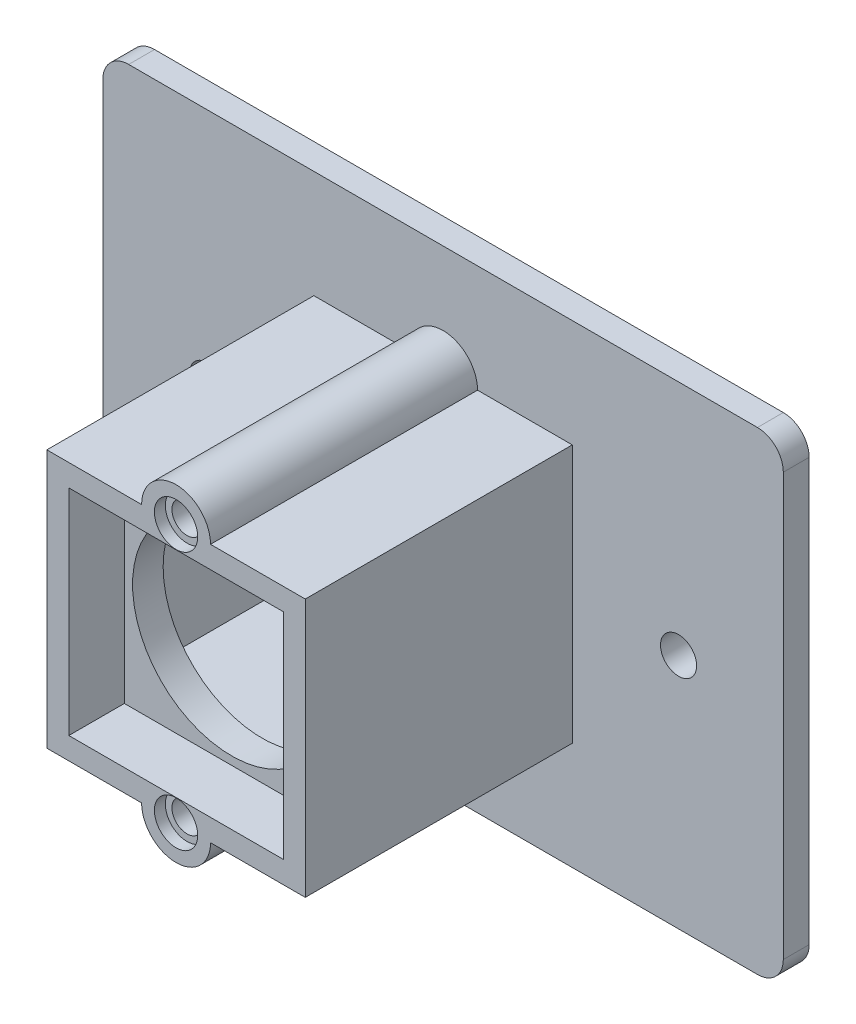
ISO-10303-21;
HEADER;
FILE_DESCRIPTION(('STEP AP214'),'2;1');
FILE_NAME('part.step','',(''),(''),'','','');
FILE_SCHEMA(('AUTOMOTIVE_DESIGN { 1 0 10303 214 1 1 1 1 }'));
ENDSEC;
DATA;
#1=APPLICATION_CONTEXT('core data for automotive mechanical design processes');
#2=APPLICATION_PROTOCOL_DEFINITION('international standard','automotive_design',2000,#1);
#3=PRODUCT_CONTEXT('',#1,'mechanical');
#4=PRODUCT('Part','Part','',(#3));
#5=PRODUCT_RELATED_PRODUCT_CATEGORY('part','',(#4));
#6=PRODUCT_DEFINITION_FORMATION('','',#4);
#7=PRODUCT_DEFINITION_CONTEXT('part definition',#1,'design');
#8=PRODUCT_DEFINITION('design','',#6,#7);
#9=PRODUCT_DEFINITION_SHAPE('','',#8);
#10=(LENGTH_UNIT() NAMED_UNIT(*) SI_UNIT(.MILLI.,.METRE.));
#11=(NAMED_UNIT(*) PLANE_ANGLE_UNIT() SI_UNIT($,.RADIAN.));
#12=(NAMED_UNIT(*) SI_UNIT($,.STERADIAN.) SOLID_ANGLE_UNIT());
#13=UNCERTAINTY_MEASURE_WITH_UNIT(LENGTH_MEASURE(1.E-05),#10,'distance_accuracy_value','');
#14=(GEOMETRIC_REPRESENTATION_CONTEXT(3) GLOBAL_UNCERTAINTY_ASSIGNED_CONTEXT((#13)) GLOBAL_UNIT_ASSIGNED_CONTEXT((#10,
#11,#12)) REPRESENTATION_CONTEXT('',''));
#15=CARTESIAN_POINT('',(0.,0.,0.));
#16=DIRECTION('',(0.,0.,1.));
#17=DIRECTION('',(1.,0.,0.));
#18=AXIS2_PLACEMENT_3D('',#15,#16,#17);
#19=CARTESIAN_POINT('',(38.,12.75,-22.));
#20=DIRECTION('',(0.,0.,-1.));
#21=DIRECTION('',(0.,1.,0.));
#22=AXIS2_PLACEMENT_3D('',#19,#20,#21);
#23=PLANE('',#22);
#24=DIRECTION('',(-1.,0.,0.));
#25=VECTOR('',#24,1.);
#26=CARTESIAN_POINT('',(0.,27.5,-22.));
#27=LINE('',#26,#25);
#28=CARTESIAN_POINT('',(36.5,27.5,-22.));
#29=VERTEX_POINT('',#28);
#30=CARTESIAN_POINT('',(-36.5,27.5,-22.));
#31=VERTEX_POINT('',#30);
#32=EDGE_CURVE('E494',#29,#31,#27,.T.);
#33=ORIENTED_EDGE('',*,*,#32,.T.);
#34=CARTESIAN_POINT('',(-36.5,24.5,-22.));
#35=DIRECTION('',(0.,0.,-1.));
#36=DIRECTION('',(0.,1.,0.));
#37=AXIS2_PLACEMENT_3D('',#34,#35,#36);
#38=CIRCLE('',#37,3.);
#39=CARTESIAN_POINT('',(-39.5,24.5,-22.));
#40=VERTEX_POINT('',#39);
#41=EDGE_CURVE('E299',#31,#40,#38,.F.);
#42=ORIENTED_EDGE('',*,*,#41,.T.);
#43=DIRECTION('',(0.,1.,0.));
#44=VECTOR('',#43,1.);
#45=CARTESIAN_POINT('',(-39.5,0.,-22.));
#46=LINE('',#45,#44);
#47=CARTESIAN_POINT('',(-39.5,-24.5,-22.));
#48=VERTEX_POINT('',#47);
#49=EDGE_CURVE('E489',#48,#40,#46,.T.);
#50=ORIENTED_EDGE('',*,*,#49,.F.);
#51=CARTESIAN_POINT('',(-36.5,-24.5,-22.));
#52=DIRECTION('',(0.,0.,-1.));
#53=DIRECTION('',(0.,1.,0.));
#54=AXIS2_PLACEMENT_3D('',#51,#52,#53);
#55=CIRCLE('',#54,3.);
#56=CARTESIAN_POINT('',(-36.5,-27.5,-22.));
#57=VERTEX_POINT('',#56);
#58=EDGE_CURVE('E296',#48,#57,#55,.F.);
#59=ORIENTED_EDGE('',*,*,#58,.T.);
#60=DIRECTION('',(-1.,0.,0.));
#61=VECTOR('',#60,1.);
#62=CARTESIAN_POINT('',(0.,-27.5,-22.));
#63=LINE('',#62,#61);
#64=CARTESIAN_POINT('',(36.5,-27.5,-22.));
#65=VERTEX_POINT('',#64);
#66=EDGE_CURVE('E485',#65,#57,#63,.T.);
#67=ORIENTED_EDGE('',*,*,#66,.F.);
#68=CARTESIAN_POINT('',(36.5,-24.5,-22.));
#69=DIRECTION('',(0.,0.,-1.));
#70=DIRECTION('',(0.,1.,0.));
#71=AXIS2_PLACEMENT_3D('',#68,#69,#70);
#72=CIRCLE('',#71,3.);
#73=CARTESIAN_POINT('',(39.5,-24.5,-22.));
#74=VERTEX_POINT('',#73);
#75=EDGE_CURVE('E293',#65,#74,#72,.F.);
#76=ORIENTED_EDGE('',*,*,#75,.T.);
#77=DIRECTION('',(0.,1.,0.));
#78=VECTOR('',#77,1.);
#79=CARTESIAN_POINT('',(39.5,0.,-22.));
#80=LINE('',#79,#78);
#81=CARTESIAN_POINT('',(39.5,24.5,-22.));
#82=VERTEX_POINT('',#81);
#83=EDGE_CURVE('E498',#74,#82,#80,.T.);
#84=ORIENTED_EDGE('',*,*,#83,.T.);
#85=CARTESIAN_POINT('',(36.5,24.5,-22.));
#86=DIRECTION('',(0.,0.,-1.));
#87=DIRECTION('',(0.,1.,0.));
#88=AXIS2_PLACEMENT_3D('',#85,#86,#87);
#89=CIRCLE('',#88,3.);
#90=EDGE_CURVE('E290',#82,#29,#89,.F.);
#91=ORIENTED_EDGE('',*,*,#90,.T.);
#92=EDGE_LOOP('',(#33,#42,#50,#59,#67,#76,#84,#91));
#93=FACE_BOUND('',#92,.T.);
#94=CARTESIAN_POINT('',(-27.34,0.,-22.));
#95=DIRECTION('',(0.,0.,-1.));
#96=DIRECTION('',(0.,1.,0.));
#97=AXIS2_PLACEMENT_3D('',#94,#95,#96);
#98=CIRCLE('',#97,2.0955);
#99=CARTESIAN_POINT('',(-27.34,2.0955,-22.));
#100=VERTEX_POINT('',#99);
#101=EDGE_CURVE('E474',#100,#100,#98,.F.);
#102=ORIENTED_EDGE('',*,*,#101,.F.);
#103=EDGE_LOOP('',(#102));
#104=FACE_BOUND('',#103,.T.);
#105=CARTESIAN_POINT('',(27.34,0.,-22.));
#106=DIRECTION('',(0.,0.,-1.));
#107=DIRECTION('',(0.,1.,0.));
#108=AXIS2_PLACEMENT_3D('',#105,#106,#107);
#109=CIRCLE('',#108,2.0955);
#110=CARTESIAN_POINT('',(27.34,2.0955,-22.));
#111=VERTEX_POINT('',#110);
#112=EDGE_CURVE('E473',#111,#111,#109,.F.);
#113=ORIENTED_EDGE('',*,*,#112,.F.);
#114=EDGE_LOOP('',(#113));
#115=FACE_BOUND('',#114,.T.);
#116=DIRECTION('',(-1.,0.,0.));
#117=VECTOR('',#116,1.);
#118=CARTESIAN_POINT('',(-4.,-15.,-22.));
#119=LINE('',#118,#117);
#120=CARTESIAN_POINT('',(-4.,-15.,-22.));
#121=VERTEX_POINT('',#120);
#122=CARTESIAN_POINT('',(-15.,-15.,-22.));
#123=VERTEX_POINT('',#122);
#124=EDGE_CURVE('E462',#121,#123,#119,.T.);
#125=ORIENTED_EDGE('',*,*,#124,.T.);
#126=DIRECTION('',(0.,1.,0.));
#127=VECTOR('',#126,1.);
#128=CARTESIAN_POINT('',(-15.,12.75,-22.));
#129=LINE('',#128,#127);
#130=CARTESIAN_POINT('',(-15.,15.,-22.));
#131=VERTEX_POINT('',#130);
#132=EDGE_CURVE('E317',#123,#131,#129,.T.);
#133=ORIENTED_EDGE('',*,*,#132,.T.);
#134=DIRECTION('',(1.,0.,0.));
#135=VECTOR('',#134,1.);
#136=CARTESIAN_POINT('',(-15.,15.,-22.));
#137=LINE('',#136,#135);
#138=CARTESIAN_POINT('',(-4.,15.,-22.));
#139=VERTEX_POINT('',#138);
#140=EDGE_CURVE('E322',#131,#139,#137,.T.);
#141=ORIENTED_EDGE('',*,*,#140,.T.);
#142=CARTESIAN_POINT('',(0.,15.,-22.));
#143=DIRECTION('',(0.,0.,-1.));
#144=DIRECTION('',(0.,1.,0.));
#145=AXIS2_PLACEMENT_3D('',#142,#143,#144);
#146=CIRCLE('',#145,4.);
#147=CARTESIAN_POINT('',(4.,15.,-22.));
#148=VERTEX_POINT('',#147);
#149=EDGE_CURVE('E326',#139,#148,#146,.T.);
#150=ORIENTED_EDGE('',*,*,#149,.T.);
#151=DIRECTION('',(1.,0.,0.));
#152=VECTOR('',#151,1.);
#153=CARTESIAN_POINT('',(4.,15.,-22.));
#154=LINE('',#153,#152);
#155=CARTESIAN_POINT('',(15.,15.,-22.));
#156=VERTEX_POINT('',#155);
#157=EDGE_CURVE('E330',#148,#156,#154,.T.);
#158=ORIENTED_EDGE('',*,*,#157,.T.);
#159=DIRECTION('',(0.,-1.,0.));
#160=VECTOR('',#159,1.);
#161=CARTESIAN_POINT('',(15.,15.,-22.));
#162=LINE('',#161,#160);
#163=CARTESIAN_POINT('',(15.,-15.,-22.));
#164=VERTEX_POINT('',#163);
#165=EDGE_CURVE('E316',#156,#164,#162,.T.);
#166=ORIENTED_EDGE('',*,*,#165,.T.);
#167=DIRECTION('',(-1.,0.,0.));
#168=VECTOR('',#167,1.);
#169=CARTESIAN_POINT('',(15.,-15.,-22.));
#170=LINE('',#169,#168);
#171=CARTESIAN_POINT('',(4.,-15.,-22.));
#172=VERTEX_POINT('',#171);
#173=EDGE_CURVE('E439',#164,#172,#170,.T.);
#174=ORIENTED_EDGE('',*,*,#173,.T.);
#175=CARTESIAN_POINT('',(0.,-15.,-22.));
#176=DIRECTION('',(0.,0.,-1.));
#177=DIRECTION('',(0.,1.,0.));
#178=AXIS2_PLACEMENT_3D('',#175,#176,#177);
#179=CIRCLE('',#178,4.);
#180=EDGE_CURVE('E457',#172,#121,#179,.T.);
#181=ORIENTED_EDGE('',*,*,#180,.T.);
#182=EDGE_LOOP('',(#125,#133,#141,#150,#158,#166,#174,#181));
#183=FACE_BOUND('',#182,.T.);
#184=ADVANCED_FACE('F43',(#93,#104,#115,#183),#23,.F.);
#185=CARTESIAN_POINT('',(0.,15.,9.));
#186=DIRECTION('',(0.,0.,1.));
#187=DIRECTION('',(1.,0.,0.));
#188=AXIS2_PLACEMENT_3D('',#185,#186,#187);
#189=PLANE('',#188);
#190=CARTESIAN_POINT('',(0.,15.,9.));
#191=DIRECTION('',(0.,0.,1.));
#192=DIRECTION('',(1.,0.,0.));
#193=AXIS2_PLACEMENT_3D('',#190,#191,#192);
#194=CIRCLE('',#193,2.5146);
#195=CARTESIAN_POINT('',(2.5146,15.,9.));
#196=VERTEX_POINT('',#195);
#197=EDGE_CURVE('E441',#196,#196,#194,.T.);
#198=ORIENTED_EDGE('',*,*,#197,.F.);
#199=EDGE_LOOP('',(#198));
#200=FACE_BOUND('',#199,.T.);
#201=CARTESIAN_POINT('',(0.,-15.,9.));
#202=DIRECTION('',(0.,0.,1.));
#203=DIRECTION('',(1.,0.,0.));
#204=AXIS2_PLACEMENT_3D('',#201,#202,#203);
#205=CIRCLE('',#204,2.5146);
#206=CARTESIAN_POINT('',(2.5146,-15.,9.));
#207=VERTEX_POINT('',#206);
#208=EDGE_CURVE('E453',#207,#207,#205,.T.);
#209=ORIENTED_EDGE('',*,*,#208,.F.);
#210=EDGE_LOOP('',(#209));
#211=FACE_BOUND('',#210,.T.);
#212=DIRECTION('',(0.,1.,0.));
#213=VECTOR('',#212,1.);
#214=CARTESIAN_POINT('',(12.45,-15.,9.));
#215=LINE('',#214,#213);
#216=CARTESIAN_POINT('',(12.45,-12.45,9.));
#217=VERTEX_POINT('',#216);
#218=CARTESIAN_POINT('',(12.45,12.45,9.));
#219=VERTEX_POINT('',#218);
#220=EDGE_CURVE('E369',#217,#219,#215,.T.);
#221=ORIENTED_EDGE('',*,*,#220,.F.);
#222=DIRECTION('',(1.,0.,0.));
#223=VECTOR('',#222,1.);
#224=CARTESIAN_POINT('',(15.,-12.45,9.));
#225=LINE('',#224,#223);
#226=CARTESIAN_POINT('',(-12.45,-12.45,9.));
#227=VERTEX_POINT('',#226);
#228=EDGE_CURVE('E376',#227,#217,#225,.T.);
#229=ORIENTED_EDGE('',*,*,#228,.F.);
#230=DIRECTION('',(0.,-1.,0.));
#231=VECTOR('',#230,1.);
#232=CARTESIAN_POINT('',(-12.45,-15.,9.));
#233=LINE('',#232,#231);
#234=CARTESIAN_POINT('',(-12.45,12.45,9.));
#235=VERTEX_POINT('',#234);
#236=EDGE_CURVE('E372',#235,#227,#233,.T.);
#237=ORIENTED_EDGE('',*,*,#236,.F.);
#238=DIRECTION('',(-1.,0.,0.));
#239=VECTOR('',#238,1.);
#240=CARTESIAN_POINT('',(-4.,12.45,9.));
#241=LINE('',#240,#239);
#242=EDGE_CURVE('E343',#219,#235,#241,.T.);
#243=ORIENTED_EDGE('',*,*,#242,.F.);
#244=EDGE_LOOP('',(#221,#229,#237,#243));
#245=FACE_BOUND('',#244,.T.);
#246=CARTESIAN_POINT('',(0.,15.,9.));
#247=DIRECTION('',(0.,0.,1.));
#248=DIRECTION('',(1.,0.,0.));
#249=AXIS2_PLACEMENT_3D('',#246,#247,#248);
#250=CIRCLE('',#249,4.);
#251=CARTESIAN_POINT('',(4.,15.,9.));
#252=VERTEX_POINT('',#251);
#253=CARTESIAN_POINT('',(-4.,15.,9.));
#254=VERTEX_POINT('',#253);
#255=EDGE_CURVE('E388',#252,#254,#250,.T.);
#256=ORIENTED_EDGE('',*,*,#255,.T.);
#257=DIRECTION('',(-1.,0.,0.));
#258=VECTOR('',#257,1.);
#259=CARTESIAN_POINT('',(-4.,15.,9.));
#260=LINE('',#259,#258);
#261=CARTESIAN_POINT('',(-15.,15.,9.));
#262=VERTEX_POINT('',#261);
#263=EDGE_CURVE('E392',#254,#262,#260,.T.);
#264=ORIENTED_EDGE('',*,*,#263,.T.);
#265=DIRECTION('',(0.,-1.,0.));
#266=VECTOR('',#265,1.);
#267=CARTESIAN_POINT('',(-15.,-15.,9.));
#268=LINE('',#267,#266);
#269=CARTESIAN_POINT('',(-15.,-15.,9.));
#270=VERTEX_POINT('',#269);
#271=EDGE_CURVE('E395',#262,#270,#268,.T.);
#272=ORIENTED_EDGE('',*,*,#271,.T.);
#273=DIRECTION('',(1.,0.,0.));
#274=VECTOR('',#273,1.);
#275=CARTESIAN_POINT('',(-4.,-15.,9.));
#276=LINE('',#275,#274);
#277=CARTESIAN_POINT('',(-4.,-15.,9.));
#278=VERTEX_POINT('',#277);
#279=EDGE_CURVE('E398',#270,#278,#276,.T.);
#280=ORIENTED_EDGE('',*,*,#279,.T.);
#281=CARTESIAN_POINT('',(0.,-15.,9.));
#282=DIRECTION('',(0.,0.,1.));
#283=DIRECTION('',(1.,0.,0.));
#284=AXIS2_PLACEMENT_3D('',#281,#282,#283);
#285=CIRCLE('',#284,4.);
#286=CARTESIAN_POINT('',(4.,-15.,9.));
#287=VERTEX_POINT('',#286);
#288=EDGE_CURVE('E401',#278,#287,#285,.T.);
#289=ORIENTED_EDGE('',*,*,#288,.T.);
#290=DIRECTION('',(1.,0.,0.));
#291=VECTOR('',#290,1.);
#292=CARTESIAN_POINT('',(15.,-15.,9.));
#293=LINE('',#292,#291);
#294=CARTESIAN_POINT('',(15.,-15.,9.));
#295=VERTEX_POINT('',#294);
#296=EDGE_CURVE('E404',#287,#295,#293,.T.);
#297=ORIENTED_EDGE('',*,*,#296,.T.);
#298=DIRECTION('',(0.,1.,0.));
#299=VECTOR('',#298,1.);
#300=CARTESIAN_POINT('',(15.,-15.,9.));
#301=LINE('',#300,#299);
#302=CARTESIAN_POINT('',(15.,15.,9.));
#303=VERTEX_POINT('',#302);
#304=EDGE_CURVE('E407',#295,#303,#301,.T.);
#305=ORIENTED_EDGE('',*,*,#304,.T.);
#306=DIRECTION('',(-1.,0.,0.));
#307=VECTOR('',#306,1.);
#308=CARTESIAN_POINT('',(15.,15.,9.));
#309=LINE('',#308,#307);
#310=EDGE_CURVE('E410',#303,#252,#309,.T.);
#311=ORIENTED_EDGE('',*,*,#310,.T.);
#312=EDGE_LOOP('',(#256,#264,#272,#280,#289,#297,#305,#311));
#313=FACE_BOUND('',#312,.T.);
#314=ADVANCED_FACE('F538',(#200,#211,#245,#313),#189,.T.);
#315=CARTESIAN_POINT('',(0.,15.,9.));
#316=DIRECTION('',(0.,0.,-1.));
#317=DIRECTION('',(-1.,0.,0.));
#318=AXIS2_PLACEMENT_3D('',#315,#316,#317);
#319=CYLINDRICAL_SURFACE('',#318,4.);
#320=DIRECTION('',(0.,0.,-1.));
#321=VECTOR('',#320,1.);
#322=CARTESIAN_POINT('',(4.,15.,9.));
#323=LINE('',#322,#321);
#324=EDGE_CURVE('E413',#252,#148,#323,.T.);
#325=ORIENTED_EDGE('',*,*,#324,.T.);
#326=ORIENTED_EDGE('',*,*,#149,.F.);
#327=DIRECTION('',(0.,0.,-1.));
#328=VECTOR('',#327,1.);
#329=CARTESIAN_POINT('',(-4.,15.,9.));
#330=LINE('',#329,#328);
#331=EDGE_CURVE('E11',#254,#139,#330,.T.);
#332=ORIENTED_EDGE('',*,*,#331,.F.);
#333=ORIENTED_EDGE('',*,*,#255,.F.);
#334=EDGE_LOOP('',(#325,#326,#332,#333));
#335=FACE_BOUND('',#334,.T.);
#336=ADVANCED_FACE('F45',(#335),#319,.T.);
#337=CARTESIAN_POINT('',(-4.,15.,9.));
#338=DIRECTION('',(0.,-1.,0.));
#339=DIRECTION('',(1.,0.,0.));
#340=AXIS2_PLACEMENT_3D('',#337,#338,#339);
#341=PLANE('',#340);
#342=ORIENTED_EDGE('',*,*,#331,.T.);
#343=ORIENTED_EDGE('',*,*,#140,.F.);
#344=DIRECTION('',(0.,0.,-1.));
#345=VECTOR('',#344,1.);
#346=CARTESIAN_POINT('',(-15.,15.,9.));
#347=LINE('',#346,#345);
#348=EDGE_CURVE('E53',#262,#131,#347,.T.);
#349=ORIENTED_EDGE('',*,*,#348,.F.);
#350=ORIENTED_EDGE('',*,*,#263,.F.);
#351=EDGE_LOOP('',(#342,#343,#349,#350));
#352=FACE_BOUND('',#351,.T.);
#353=ADVANCED_FACE('F668',(#352),#341,.F.);
#354=CARTESIAN_POINT('',(-15.,-15.,9.));
#355=DIRECTION('',(1.,0.,0.));
#356=DIRECTION('',(0.,1.,0.));
#357=AXIS2_PLACEMENT_3D('',#354,#355,#356);
#358=PLANE('',#357);
#359=ORIENTED_EDGE('',*,*,#132,.F.);
#360=DIRECTION('',(0.,0.,-1.));
#361=VECTOR('',#360,1.);
#362=CARTESIAN_POINT('',(-15.,-15.,9.));
#363=LINE('',#362,#361);
#364=EDGE_CURVE('E61',#270,#123,#363,.T.);
#365=ORIENTED_EDGE('',*,*,#364,.F.);
#366=ORIENTED_EDGE('',*,*,#271,.F.);
#367=ORIENTED_EDGE('',*,*,#348,.T.);
#368=EDGE_LOOP('',(#359,#365,#366,#367));
#369=FACE_BOUND('',#368,.T.);
#370=ADVANCED_FACE('F666',(#369),#358,.F.);
#371=CARTESIAN_POINT('',(-4.,-15.,9.));
#372=DIRECTION('',(0.,1.,0.));
#373=DIRECTION('',(-1.,0.,0.));
#374=AXIS2_PLACEMENT_3D('',#371,#372,#373);
#375=PLANE('',#374);
#376=ORIENTED_EDGE('',*,*,#364,.T.);
#377=ORIENTED_EDGE('',*,*,#124,.F.);
#378=DIRECTION('',(0.,0.,-1.));
#379=VECTOR('',#378,1.);
#380=CARTESIAN_POINT('',(-4.,-15.,9.));
#381=LINE('',#380,#379);
#382=EDGE_CURVE('E424',#278,#121,#381,.T.);
#383=ORIENTED_EDGE('',*,*,#382,.F.);
#384=ORIENTED_EDGE('',*,*,#279,.F.);
#385=EDGE_LOOP('',(#376,#377,#383,#384));
#386=FACE_BOUND('',#385,.T.);
#387=ADVANCED_FACE('F662',(#386),#375,.F.);
#388=CARTESIAN_POINT('',(0.,-15.,9.));
#389=DIRECTION('',(0.,0.,-1.));
#390=DIRECTION('',(-1.,0.,0.));
#391=AXIS2_PLACEMENT_3D('',#388,#389,#390);
#392=CYLINDRICAL_SURFACE('',#391,4.);
#393=ORIENTED_EDGE('',*,*,#382,.T.);
#394=ORIENTED_EDGE('',*,*,#180,.F.);
#395=DIRECTION('',(0.,0.,-1.));
#396=VECTOR('',#395,1.);
#397=CARTESIAN_POINT('',(4.,-15.,9.));
#398=LINE('',#397,#396);
#399=EDGE_CURVE('E421',#287,#172,#398,.T.);
#400=ORIENTED_EDGE('',*,*,#399,.F.);
#401=ORIENTED_EDGE('',*,*,#288,.F.);
#402=EDGE_LOOP('',(#393,#394,#400,#401));
#403=FACE_BOUND('',#402,.T.);
#404=ADVANCED_FACE('F658',(#403),#392,.T.);
#405=CARTESIAN_POINT('',(15.,-15.,9.));
#406=DIRECTION('',(0.,1.,0.));
#407=DIRECTION('',(-1.,0.,0.));
#408=AXIS2_PLACEMENT_3D('',#405,#406,#407);
#409=PLANE('',#408);
#410=ORIENTED_EDGE('',*,*,#399,.T.);
#411=ORIENTED_EDGE('',*,*,#173,.F.);
#412=DIRECTION('',(0.,0.,-1.));
#413=VECTOR('',#412,1.);
#414=CARTESIAN_POINT('',(15.,-15.,9.));
#415=LINE('',#414,#413);
#416=EDGE_CURVE('E69',#295,#164,#415,.T.);
#417=ORIENTED_EDGE('',*,*,#416,.F.);
#418=ORIENTED_EDGE('',*,*,#296,.F.);
#419=EDGE_LOOP('',(#410,#411,#417,#418));
#420=FACE_BOUND('',#419,.T.);
#421=ADVANCED_FACE('F655',(#420),#409,.F.);
#422=CARTESIAN_POINT('',(15.,-15.,9.));
#423=DIRECTION('',(-1.,0.,0.));
#424=DIRECTION('',(0.,0.,1.));
#425=AXIS2_PLACEMENT_3D('',#422,#423,#424);
#426=PLANE('',#425);
#427=ORIENTED_EDGE('',*,*,#416,.T.);
#428=ORIENTED_EDGE('',*,*,#165,.F.);
#429=DIRECTION('',(0.,0.,-1.));
#430=VECTOR('',#429,1.);
#431=CARTESIAN_POINT('',(15.,15.,9.));
#432=LINE('',#431,#430);
#433=EDGE_CURVE('E416',#303,#156,#432,.T.);
#434=ORIENTED_EDGE('',*,*,#433,.F.);
#435=ORIENTED_EDGE('',*,*,#304,.F.);
#436=EDGE_LOOP('',(#427,#428,#434,#435));
#437=FACE_BOUND('',#436,.T.);
#438=ADVANCED_FACE('F651',(#437),#426,.F.);
#439=CARTESIAN_POINT('',(15.,15.,9.));
#440=DIRECTION('',(0.,-1.,0.));
#441=DIRECTION('',(0.,0.,-1.));
#442=AXIS2_PLACEMENT_3D('',#439,#440,#441);
#443=PLANE('',#442);
#444=ORIENTED_EDGE('',*,*,#433,.T.);
#445=ORIENTED_EDGE('',*,*,#157,.F.);
#446=ORIENTED_EDGE('',*,*,#324,.F.);
#447=ORIENTED_EDGE('',*,*,#310,.F.);
#448=EDGE_LOOP('',(#444,#445,#446,#447));
#449=FACE_BOUND('',#448,.T.);
#450=ADVANCED_FACE('F625',(#449),#443,.F.);
#451=CARTESIAN_POINT('',(0.,15.,2.55));
#452=DIRECTION('',(0.,0.,1.));
#453=DIRECTION('',(1.,0.,0.));
#454=AXIS2_PLACEMENT_3D('',#451,#452,#453);
#455=PLANE('',#454);
#456=CARTESIAN_POINT('',(0.,0.,2.55));
#457=DIRECTION('',(0.,0.,1.));
#458=DIRECTION('',(1.,0.,0.));
#459=AXIS2_PLACEMENT_3D('',#456,#457,#458);
#460=CIRCLE('',#459,11.5);
#461=CARTESIAN_POINT('',(11.5,0.,2.55));
#462=VERTEX_POINT('',#461);
#463=EDGE_CURVE('E321',#462,#462,#460,.T.);
#464=ORIENTED_EDGE('',*,*,#463,.F.);
#465=EDGE_LOOP('',(#464));
#466=FACE_BOUND('',#465,.T.);
#467=DIRECTION('',(0.,1.,0.));
#468=VECTOR('',#467,1.);
#469=CARTESIAN_POINT('',(12.45,-15.,2.55));
#470=LINE('',#469,#468);
#471=CARTESIAN_POINT('',(12.45,-12.45,2.55));
#472=VERTEX_POINT('',#471);
#473=CARTESIAN_POINT('',(12.45,12.45,2.55));
#474=VERTEX_POINT('',#473);
#475=EDGE_CURVE('E344',#472,#474,#470,.T.);
#476=ORIENTED_EDGE('',*,*,#475,.T.);
#477=DIRECTION('',(-1.,0.,0.));
#478=VECTOR('',#477,1.);
#479=CARTESIAN_POINT('',(15.,12.45,2.55));
#480=LINE('',#479,#478);
#481=CARTESIAN_POINT('',(-12.45,12.45,2.55));
#482=VERTEX_POINT('',#481);
#483=EDGE_CURVE('E340',#474,#482,#480,.T.);
#484=ORIENTED_EDGE('',*,*,#483,.T.);
#485=DIRECTION('',(0.,-1.,0.));
#486=VECTOR('',#485,1.);
#487=CARTESIAN_POINT('',(-12.45,-15.,2.55));
#488=LINE('',#487,#486);
#489=CARTESIAN_POINT('',(-12.45,-12.45,2.55));
#490=VERTEX_POINT('',#489);
#491=EDGE_CURVE('E339',#482,#490,#488,.T.);
#492=ORIENTED_EDGE('',*,*,#491,.T.);
#493=DIRECTION('',(1.,0.,0.));
#494=VECTOR('',#493,1.);
#495=CARTESIAN_POINT('',(-4.,-12.45,2.55));
#496=LINE('',#495,#494);
#497=EDGE_CURVE('E347',#490,#472,#496,.T.);
#498=ORIENTED_EDGE('',*,*,#497,.T.);
#499=EDGE_LOOP('',(#476,#484,#492,#498));
#500=FACE_BOUND('',#499,.T.);
#501=ADVANCED_FACE('F621',(#466,#500),#455,.T.);
#502=CARTESIAN_POINT('',(-4.,12.45,9.));
#503=DIRECTION('',(0.,-1.,0.));
#504=DIRECTION('',(1.,0.,0.));
#505=AXIS2_PLACEMENT_3D('',#502,#503,#504);
#506=PLANE('',#505);
#507=ORIENTED_EDGE('',*,*,#483,.F.);
#508=DIRECTION('',(0.,0.,-1.));
#509=VECTOR('',#508,1.);
#510=CARTESIAN_POINT('',(12.45,12.45,9.));
#511=LINE('',#510,#509);
#512=EDGE_CURVE('E365',#219,#474,#511,.T.);
#513=ORIENTED_EDGE('',*,*,#512,.F.);
#514=ORIENTED_EDGE('',*,*,#242,.T.);
#515=DIRECTION('',(0.,0.,-1.));
#516=VECTOR('',#515,1.);
#517=CARTESIAN_POINT('',(-12.45,12.45,9.));
#518=LINE('',#517,#516);
#519=EDGE_CURVE('E352',#235,#482,#518,.T.);
#520=ORIENTED_EDGE('',*,*,#519,.T.);
#521=EDGE_LOOP('',(#507,#513,#514,#520));
#522=FACE_BOUND('',#521,.T.);
#523=ADVANCED_FACE('F624',(#522),#506,.T.);
#524=CARTESIAN_POINT('',(-12.45,-15.,9.));
#525=DIRECTION('',(1.,0.,0.));
#526=DIRECTION('',(0.,1.,0.));
#527=AXIS2_PLACEMENT_3D('',#524,#525,#526);
#528=PLANE('',#527);
#529=ORIENTED_EDGE('',*,*,#491,.F.);
#530=ORIENTED_EDGE('',*,*,#519,.F.);
#531=ORIENTED_EDGE('',*,*,#236,.T.);
#532=DIRECTION('',(0.,0.,-1.));
#533=VECTOR('',#532,1.);
#534=CARTESIAN_POINT('',(-12.45,-12.45,9.));
#535=LINE('',#534,#533);
#536=EDGE_CURVE('E357',#227,#490,#535,.T.);
#537=ORIENTED_EDGE('',*,*,#536,.T.);
#538=EDGE_LOOP('',(#529,#530,#531,#537));
#539=FACE_BOUND('',#538,.T.);
#540=ADVANCED_FACE('F629',(#539),#528,.T.);
#541=CARTESIAN_POINT('',(-4.,-12.45,9.));
#542=DIRECTION('',(0.,1.,0.));
#543=DIRECTION('',(-1.,0.,0.));
#544=AXIS2_PLACEMENT_3D('',#541,#542,#543);
#545=PLANE('',#544);
#546=ORIENTED_EDGE('',*,*,#497,.F.);
#547=ORIENTED_EDGE('',*,*,#536,.F.);
#548=ORIENTED_EDGE('',*,*,#228,.T.);
#549=DIRECTION('',(0.,0.,-1.));
#550=VECTOR('',#549,1.);
#551=CARTESIAN_POINT('',(12.45,-12.45,9.));
#552=LINE('',#551,#550);
#553=EDGE_CURVE('E361',#217,#472,#552,.T.);
#554=ORIENTED_EDGE('',*,*,#553,.T.);
#555=EDGE_LOOP('',(#546,#547,#548,#554));
#556=FACE_BOUND('',#555,.T.);
#557=ADVANCED_FACE('F633',(#556),#545,.T.);
#558=CARTESIAN_POINT('',(12.45,-15.,9.));
#559=DIRECTION('',(-1.,0.,0.));
#560=DIRECTION('',(0.,0.,1.));
#561=AXIS2_PLACEMENT_3D('',#558,#559,#560);
#562=PLANE('',#561);
#563=ORIENTED_EDGE('',*,*,#475,.F.);
#564=ORIENTED_EDGE('',*,*,#553,.F.);
#565=ORIENTED_EDGE('',*,*,#220,.T.);
#566=ORIENTED_EDGE('',*,*,#512,.T.);
#567=EDGE_LOOP('',(#563,#564,#565,#566));
#568=FACE_BOUND('',#567,.T.);
#569=ADVANCED_FACE('F619',(#568),#562,.T.);
#570=CARTESIAN_POINT('',(0.,0.,-0.00100000000000013));
#571=DIRECTION('',(0.,0.,1.));
#572=DIRECTION('',(1.,0.,0.));
#573=AXIS2_PLACEMENT_3D('',#570,#571,#572);
#574=CYLINDRICAL_SURFACE('',#573,11.5);
#575=ORIENTED_EDGE('',*,*,#463,.T.);
#576=EDGE_LOOP('',(#575));
#577=FACE_BOUND('',#576,.T.);
#578=CARTESIAN_POINT('',(0.,0.,-1.));
#579=DIRECTION('',(0.,0.,-1.));
#580=DIRECTION('',(-1.,0.,0.));
#581=AXIS2_PLACEMENT_3D('',#578,#579,#580);
#582=CIRCLE('',#581,11.5);
#583=CARTESIAN_POINT('',(-11.5,0.,-1.));
#584=VERTEX_POINT('',#583);
#585=EDGE_CURVE('E222',#584,#584,#582,.T.);
#586=ORIENTED_EDGE('',*,*,#585,.T.);
#587=EDGE_LOOP('',(#586));
#588=FACE_BOUND('',#587,.T.);
#589=ADVANCED_FACE('F520',(#577,#588),#574,.F.);
#590=CARTESIAN_POINT('',(0.,0.,-25.));
#591=DIRECTION('',(0.,0.,-1.));
#592=DIRECTION('',(-1.,0.,0.));
#593=AXIS2_PLACEMENT_3D('',#590,#591,#592);
#594=PLANE('',#593);
#595=CARTESIAN_POINT('',(27.34,0.,-25.));
#596=DIRECTION('',(0.,0.,-1.));
#597=DIRECTION('',(-1.,0.,0.));
#598=AXIS2_PLACEMENT_3D('',#595,#596,#597);
#599=CIRCLE('',#598,2.0955);
#600=CARTESIAN_POINT('',(25.2445,0.,-25.));
#601=VERTEX_POINT('',#600);
#602=EDGE_CURVE('E469',#601,#601,#599,.T.);
#603=ORIENTED_EDGE('',*,*,#602,.F.);
#604=EDGE_LOOP('',(#603));
#605=FACE_BOUND('',#604,.T.);
#606=CARTESIAN_POINT('',(-27.34,0.,-25.));
#607=DIRECTION('',(0.,0.,-1.));
#608=DIRECTION('',(-1.,0.,0.));
#609=AXIS2_PLACEMENT_3D('',#606,#607,#608);
#610=CIRCLE('',#609,2.0955);
#611=CARTESIAN_POINT('',(-29.4355,0.,-25.));
#612=VERTEX_POINT('',#611);
#613=EDGE_CURVE('E461',#612,#612,#610,.T.);
#614=ORIENTED_EDGE('',*,*,#613,.F.);
#615=EDGE_LOOP('',(#614));
#616=FACE_BOUND('',#615,.T.);
#617=DIRECTION('',(1.,0.,0.));
#618=VECTOR('',#617,1.);
#619=CARTESIAN_POINT('',(15.,11.75,-25.));
#620=LINE('',#619,#618);
#621=CARTESIAN_POINT('',(-14.,11.75,-25.));
#622=VERTEX_POINT('',#621);
#623=CARTESIAN_POINT('',(14.,11.75,-25.));
#624=VERTEX_POINT('',#623);
#625=EDGE_CURVE('E228',#622,#624,#620,.T.);
#626=ORIENTED_EDGE('',*,*,#625,.F.);
#627=DIRECTION('',(0.,1.,0.));
#628=VECTOR('',#627,1.);
#629=CARTESIAN_POINT('',(-14.,-12.75,-25.));
#630=LINE('',#629,#628);
#631=CARTESIAN_POINT('',(-14.,-11.75,-25.));
#632=VERTEX_POINT('',#631);
#633=EDGE_CURVE('E262',#632,#622,#630,.T.);
#634=ORIENTED_EDGE('',*,*,#633,.F.);
#635=DIRECTION('',(-1.,0.,0.));
#636=VECTOR('',#635,1.);
#637=CARTESIAN_POINT('',(-2.38999999999999,-11.75,-25.));
#638=LINE('',#637,#636);
#639=CARTESIAN_POINT('',(14.,-11.75,-25.));
#640=VERTEX_POINT('',#639);
#641=EDGE_CURVE('E258',#640,#632,#638,.T.);
#642=ORIENTED_EDGE('',*,*,#641,.F.);
#643=DIRECTION('',(0.,-1.,0.));
#644=VECTOR('',#643,1.);
#645=CARTESIAN_POINT('',(14.,-12.75,-25.));
#646=LINE('',#645,#644);
#647=EDGE_CURVE('E255',#624,#640,#646,.T.);
#648=ORIENTED_EDGE('',*,*,#647,.F.);
#649=EDGE_LOOP('',(#626,#634,#642,#648));
#650=FACE_BOUND('',#649,.T.);
#651=DIRECTION('',(0.,1.,0.));
#652=VECTOR('',#651,1.);
#653=CARTESIAN_POINT('',(-39.5,0.,-25.));
#654=LINE('',#653,#652);
#655=CARTESIAN_POINT('',(-39.5,-24.5,-25.));
#656=VERTEX_POINT('',#655);
#657=CARTESIAN_POINT('',(-39.5,24.5,-25.));
#658=VERTEX_POINT('',#657);
#659=EDGE_CURVE('E505',#656,#658,#654,.T.);
#660=ORIENTED_EDGE('',*,*,#659,.T.);
#661=CARTESIAN_POINT('',(-36.5,24.5,-25.));
#662=DIRECTION('',(0.,0.,-1.));
#663=DIRECTION('',(-1.,0.,0.));
#664=AXIS2_PLACEMENT_3D('',#661,#662,#663);
#665=CIRCLE('',#664,3.);
#666=CARTESIAN_POINT('',(-36.5,27.5,-25.));
#667=VERTEX_POINT('',#666);
#668=EDGE_CURVE('E280',#658,#667,#665,.T.);
#669=ORIENTED_EDGE('',*,*,#668,.T.);
#670=DIRECTION('',(-1.,0.,0.));
#671=VECTOR('',#670,1.);
#672=CARTESIAN_POINT('',(0.,27.5,-25.));
#673=LINE('',#672,#671);
#674=CARTESIAN_POINT('',(36.5,27.5,-25.));
#675=VERTEX_POINT('',#674);
#676=EDGE_CURVE('E509',#675,#667,#673,.T.);
#677=ORIENTED_EDGE('',*,*,#676,.F.);
#678=CARTESIAN_POINT('',(36.5,24.5,-25.));
#679=DIRECTION('',(0.,0.,-1.));
#680=DIRECTION('',(-1.,0.,0.));
#681=AXIS2_PLACEMENT_3D('',#678,#679,#680);
#682=CIRCLE('',#681,3.);
#683=CARTESIAN_POINT('',(39.5,24.5,-25.));
#684=VERTEX_POINT('',#683);
#685=EDGE_CURVE('E271',#675,#684,#682,.T.);
#686=ORIENTED_EDGE('',*,*,#685,.T.);
#687=DIRECTION('',(0.,1.,0.));
#688=VECTOR('',#687,1.);
#689=CARTESIAN_POINT('',(39.5,0.,-25.));
#690=LINE('',#689,#688);
#691=CARTESIAN_POINT('',(39.5,-24.5,-25.));
#692=VERTEX_POINT('',#691);
#693=EDGE_CURVE('E490',#692,#684,#690,.T.);
#694=ORIENTED_EDGE('',*,*,#693,.F.);
#695=CARTESIAN_POINT('',(36.5,-24.5,-25.));
#696=DIRECTION('',(0.,0.,-1.));
#697=DIRECTION('',(-1.,0.,0.));
#698=AXIS2_PLACEMENT_3D('',#695,#696,#697);
#699=CIRCLE('',#698,3.);
#700=CARTESIAN_POINT('',(36.5,-27.5,-25.));
#701=VERTEX_POINT('',#700);
#702=EDGE_CURVE('E274',#692,#701,#699,.T.);
#703=ORIENTED_EDGE('',*,*,#702,.T.);
#704=DIRECTION('',(-1.,0.,0.));
#705=VECTOR('',#704,1.);
#706=CARTESIAN_POINT('',(0.,-27.5,-25.));
#707=LINE('',#706,#705);
#708=CARTESIAN_POINT('',(-36.5,-27.5,-25.));
#709=VERTEX_POINT('',#708);
#710=EDGE_CURVE('E478',#701,#709,#707,.T.);
#711=ORIENTED_EDGE('',*,*,#710,.T.);
#712=CARTESIAN_POINT('',(-36.5,-24.5,-25.));
#713=DIRECTION('',(0.,0.,-1.));
#714=DIRECTION('',(-1.,0.,0.));
#715=AXIS2_PLACEMENT_3D('',#712,#713,#714);
#716=CIRCLE('',#715,3.);
#717=EDGE_CURVE('E277',#709,#656,#716,.T.);
#718=ORIENTED_EDGE('',*,*,#717,.T.);
#719=EDGE_LOOP('',(#660,#669,#677,#686,#694,#703,#711,#718));
#720=FACE_BOUND('',#719,.T.);
#721=ADVANCED_FACE('F551',(#605,#616,#650,#720),#594,.T.);
#722=CARTESIAN_POINT('',(15.,11.75,-25.));
#723=DIRECTION('',(0.,-1.,0.));
#724=DIRECTION('',(0.,0.,-1.));
#725=AXIS2_PLACEMENT_3D('',#722,#723,#724);
#726=PLANE('',#725);
#727=DIRECTION('',(1.,0.,0.));
#728=VECTOR('',#727,1.);
#729=CARTESIAN_POINT('',(15.,11.75,-1.));
#730=LINE('',#729,#728);
#731=CARTESIAN_POINT('',(-14.,11.75,-1.));
#732=VERTEX_POINT('',#731);
#733=CARTESIAN_POINT('',(14.,11.75,-1.));
#734=VERTEX_POINT('',#733);
#735=EDGE_CURVE('E210',#732,#734,#730,.T.);
#736=ORIENTED_EDGE('',*,*,#735,.F.);
#737=DIRECTION('',(0.,0.,1.));
#738=VECTOR('',#737,1.);
#739=CARTESIAN_POINT('',(-14.,11.75,-25.));
#740=LINE('',#739,#738);
#741=EDGE_CURVE('E244',#622,#732,#740,.T.);
#742=ORIENTED_EDGE('',*,*,#741,.F.);
#743=ORIENTED_EDGE('',*,*,#625,.T.);
#744=DIRECTION('',(0.,0.,1.));
#745=VECTOR('',#744,1.);
#746=CARTESIAN_POINT('',(14.,11.75,-25.));
#747=LINE('',#746,#745);
#748=EDGE_CURVE('E225',#624,#734,#747,.T.);
#749=ORIENTED_EDGE('',*,*,#748,.T.);
#750=EDGE_LOOP('',(#736,#742,#743,#749));
#751=FACE_BOUND('',#750,.T.);
#752=ADVANCED_FACE('F226',(#751),#726,.T.);
#753=CARTESIAN_POINT('',(14.,-12.75,-25.));
#754=DIRECTION('',(-1.,0.,0.));
#755=DIRECTION('',(0.,0.,1.));
#756=AXIS2_PLACEMENT_3D('',#753,#754,#755);
#757=PLANE('',#756);
#758=DIRECTION('',(0.,-1.,0.));
#759=VECTOR('',#758,1.);
#760=CARTESIAN_POINT('',(14.,-12.75,-1.));
#761=LINE('',#760,#759);
#762=CARTESIAN_POINT('',(14.,-11.75,-1.));
#763=VERTEX_POINT('',#762);
#764=EDGE_CURVE('E214',#734,#763,#761,.T.);
#765=ORIENTED_EDGE('',*,*,#764,.F.);
#766=ORIENTED_EDGE('',*,*,#748,.F.);
#767=ORIENTED_EDGE('',*,*,#647,.T.);
#768=DIRECTION('',(0.,0.,1.));
#769=VECTOR('',#768,1.);
#770=CARTESIAN_POINT('',(14.,-11.75,-25.));
#771=LINE('',#770,#769);
#772=EDGE_CURVE('E233',#640,#763,#771,.T.);
#773=ORIENTED_EDGE('',*,*,#772,.T.);
#774=EDGE_LOOP('',(#765,#766,#767,#773));
#775=FACE_BOUND('',#774,.T.);
#776=ADVANCED_FACE('F235',(#775),#757,.T.);
#777=CARTESIAN_POINT('',(-2.38999999999999,-11.75,-25.));
#778=DIRECTION('',(0.,1.,0.));
#779=DIRECTION('',(0.,0.,1.));
#780=AXIS2_PLACEMENT_3D('',#777,#778,#779);
#781=PLANE('',#780);
#782=DIRECTION('',(-1.,0.,0.));
#783=VECTOR('',#782,1.);
#784=CARTESIAN_POINT('',(-2.38999999999999,-11.75,-1.));
#785=LINE('',#784,#783);
#786=CARTESIAN_POINT('',(-14.,-11.75,-1.));
#787=VERTEX_POINT('',#786);
#788=EDGE_CURVE('E238',#763,#787,#785,.T.);
#789=ORIENTED_EDGE('',*,*,#788,.F.);
#790=ORIENTED_EDGE('',*,*,#772,.F.);
#791=ORIENTED_EDGE('',*,*,#641,.T.);
#792=DIRECTION('',(0.,0.,1.));
#793=VECTOR('',#792,1.);
#794=CARTESIAN_POINT('',(-14.,-11.75,-25.));
#795=LINE('',#794,#793);
#796=EDGE_CURVE('E246',#632,#787,#795,.T.);
#797=ORIENTED_EDGE('',*,*,#796,.T.);
#798=EDGE_LOOP('',(#789,#790,#791,#797));
#799=FACE_BOUND('',#798,.T.);
#800=ADVANCED_FACE('F533',(#799),#781,.T.);
#801=CARTESIAN_POINT('',(-14.,-12.75,-25.));
#802=DIRECTION('',(1.,0.,0.));
#803=DIRECTION('',(0.,0.,-1.));
#804=AXIS2_PLACEMENT_3D('',#801,#802,#803);
#805=PLANE('',#804);
#806=DIRECTION('',(0.,1.,0.));
#807=VECTOR('',#806,1.);
#808=CARTESIAN_POINT('',(-14.,-12.75,-1.));
#809=LINE('',#808,#807);
#810=EDGE_CURVE('E217',#787,#732,#809,.T.);
#811=ORIENTED_EDGE('',*,*,#810,.F.);
#812=ORIENTED_EDGE('',*,*,#796,.F.);
#813=ORIENTED_EDGE('',*,*,#633,.T.);
#814=ORIENTED_EDGE('',*,*,#741,.T.);
#815=EDGE_LOOP('',(#811,#812,#813,#814));
#816=FACE_BOUND('',#815,.T.);
#817=ADVANCED_FACE('F524',(#816),#805,.T.);
#818=CARTESIAN_POINT('',(0.,0.,-1.));
#819=DIRECTION('',(0.,0.,-1.));
#820=DIRECTION('',(-1.,0.,0.));
#821=AXIS2_PLACEMENT_3D('',#818,#819,#820);
#822=PLANE('',#821);
#823=ORIENTED_EDGE('',*,*,#585,.F.);
#824=EDGE_LOOP('',(#823));
#825=FACE_BOUND('',#824,.T.);
#826=ORIENTED_EDGE('',*,*,#735,.T.);
#827=ORIENTED_EDGE('',*,*,#764,.T.);
#828=ORIENTED_EDGE('',*,*,#788,.T.);
#829=ORIENTED_EDGE('',*,*,#810,.T.);
#830=EDGE_LOOP('',(#826,#827,#828,#829));
#831=FACE_BOUND('',#830,.T.);
#832=ADVANCED_FACE('F212',(#825,#831),#822,.T.);
#833=CARTESIAN_POINT('',(0.,-27.5,-22.));
#834=DIRECTION('',(0.,-1.,0.));
#835=DIRECTION('',(0.,0.,-1.));
#836=AXIS2_PLACEMENT_3D('',#833,#834,#835);
#837=PLANE('',#836);
#838=ORIENTED_EDGE('',*,*,#66,.T.);
#839=DIRECTION('',(0.,0.,-1.));
#840=VECTOR('',#839,1.);
#841=CARTESIAN_POINT('',(-36.5,-27.5,-22.));
#842=LINE('',#841,#840);
#843=EDGE_CURVE('E305',#57,#709,#842,.T.);
#844=ORIENTED_EDGE('',*,*,#843,.T.);
#845=ORIENTED_EDGE('',*,*,#710,.F.);
#846=DIRECTION('',(0.,0.,-1.));
#847=VECTOR('',#846,1.);
#848=CARTESIAN_POINT('',(36.5,-27.5,-22.));
#849=LINE('',#848,#847);
#850=EDGE_CURVE('E302',#701,#65,#849,.F.);
#851=ORIENTED_EDGE('',*,*,#850,.T.);
#852=EDGE_LOOP('',(#838,#844,#845,#851));
#853=FACE_BOUND('',#852,.T.);
#854=ADVANCED_FACE('F523',(#853),#837,.T.);
#855=CARTESIAN_POINT('',(39.5,0.,-22.));
#856=DIRECTION('',(-1.,0.,0.));
#857=DIRECTION('',(0.,0.,1.));
#858=AXIS2_PLACEMENT_3D('',#855,#856,#857);
#859=PLANE('',#858);
#860=ORIENTED_EDGE('',*,*,#83,.F.);
#861=DIRECTION('',(0.,0.,-1.));
#862=VECTOR('',#861,1.);
#863=CARTESIAN_POINT('',(39.5,-24.5,-25.));
#864=LINE('',#863,#862);
#865=EDGE_CURVE('E312',#74,#692,#864,.T.);
#866=ORIENTED_EDGE('',*,*,#865,.T.);
#867=ORIENTED_EDGE('',*,*,#693,.T.);
#868=DIRECTION('',(0.,0.,-1.));
#869=VECTOR('',#868,1.);
#870=CARTESIAN_POINT('',(39.5,24.5,-22.));
#871=LINE('',#870,#869);
#872=EDGE_CURVE('E309',#684,#82,#871,.F.);
#873=ORIENTED_EDGE('',*,*,#872,.T.);
#874=EDGE_LOOP('',(#860,#866,#867,#873));
#875=FACE_BOUND('',#874,.T.);
#876=ADVANCED_FACE('F530',(#875),#859,.F.);
#877=CARTESIAN_POINT('',(0.,27.5,-22.));
#878=DIRECTION('',(0.,-1.,0.));
#879=DIRECTION('',(0.,0.,-1.));
#880=AXIS2_PLACEMENT_3D('',#877,#878,#879);
#881=PLANE('',#880);
#882=ORIENTED_EDGE('',*,*,#676,.T.);
#883=DIRECTION('',(0.,0.,-1.));
#884=VECTOR('',#883,1.);
#885=CARTESIAN_POINT('',(-36.5,27.5,-22.));
#886=LINE('',#885,#884);
#887=EDGE_CURVE('E287',#667,#31,#886,.F.);
#888=ORIENTED_EDGE('',*,*,#887,.T.);
#889=ORIENTED_EDGE('',*,*,#32,.F.);
#890=DIRECTION('',(0.,0.,-1.));
#891=VECTOR('',#890,1.);
#892=CARTESIAN_POINT('',(36.5,27.5,-22.));
#893=LINE('',#892,#891);
#894=EDGE_CURVE('E283',#29,#675,#893,.T.);
#895=ORIENTED_EDGE('',*,*,#894,.T.);
#896=EDGE_LOOP('',(#882,#888,#889,#895));
#897=FACE_BOUND('',#896,.T.);
#898=ADVANCED_FACE('F594',(#897),#881,.F.);
#899=CARTESIAN_POINT('',(-39.5,0.,-22.));
#900=DIRECTION('',(-1.,0.,0.));
#901=DIRECTION('',(0.,0.,1.));
#902=AXIS2_PLACEMENT_3D('',#899,#900,#901);
#903=PLANE('',#902);
#904=ORIENTED_EDGE('',*,*,#49,.T.);
#905=DIRECTION('',(0.,0.,-1.));
#906=VECTOR('',#905,1.);
#907=CARTESIAN_POINT('',(-39.5,24.5,-25.));
#908=LINE('',#907,#906);
#909=EDGE_CURVE('E267',#40,#658,#908,.T.);
#910=ORIENTED_EDGE('',*,*,#909,.T.);
#911=ORIENTED_EDGE('',*,*,#659,.F.);
#912=DIRECTION('',(0.,0.,-1.));
#913=VECTOR('',#912,1.);
#914=CARTESIAN_POINT('',(-39.5,-24.5,-22.));
#915=LINE('',#914,#913);
#916=EDGE_CURVE('E232',#656,#48,#915,.F.);
#917=ORIENTED_EDGE('',*,*,#916,.T.);
#918=EDGE_LOOP('',(#904,#910,#911,#917));
#919=FACE_BOUND('',#918,.T.);
#920=ADVANCED_FACE('F569',(#919),#903,.T.);
#921=CARTESIAN_POINT('',(-36.5,24.5,-22.));
#922=DIRECTION('',(0.,0.,1.));
#923=DIRECTION('',(1.,0.,0.));
#924=AXIS2_PLACEMENT_3D('',#921,#922,#923);
#925=CYLINDRICAL_SURFACE('',#924,3.);
#926=ORIENTED_EDGE('',*,*,#41,.F.);
#927=ORIENTED_EDGE('',*,*,#887,.F.);
#928=ORIENTED_EDGE('',*,*,#668,.F.);
#929=ORIENTED_EDGE('',*,*,#909,.F.);
#930=EDGE_LOOP('',(#926,#927,#928,#929));
#931=FACE_BOUND('',#930,.T.);
#932=ADVANCED_FACE('F597',(#931),#925,.T.);
#933=CARTESIAN_POINT('',(-36.5,-24.5,-22.));
#934=DIRECTION('',(0.,0.,-1.));
#935=DIRECTION('',(-1.,0.,0.));
#936=AXIS2_PLACEMENT_3D('',#933,#934,#935);
#937=CYLINDRICAL_SURFACE('',#936,3.);
#938=ORIENTED_EDGE('',*,*,#58,.F.);
#939=ORIENTED_EDGE('',*,*,#916,.F.);
#940=ORIENTED_EDGE('',*,*,#717,.F.);
#941=ORIENTED_EDGE('',*,*,#843,.F.);
#942=EDGE_LOOP('',(#938,#939,#940,#941));
#943=FACE_BOUND('',#942,.T.);
#944=ADVANCED_FACE('F574',(#943),#937,.T.);
#945=CARTESIAN_POINT('',(36.5,-24.5,-22.));
#946=DIRECTION('',(0.,0.,1.));
#947=DIRECTION('',(1.,0.,0.));
#948=AXIS2_PLACEMENT_3D('',#945,#946,#947);
#949=CYLINDRICAL_SURFACE('',#948,3.);
#950=ORIENTED_EDGE('',*,*,#75,.F.);
#951=ORIENTED_EDGE('',*,*,#850,.F.);
#952=ORIENTED_EDGE('',*,*,#702,.F.);
#953=ORIENTED_EDGE('',*,*,#865,.F.);
#954=EDGE_LOOP('',(#950,#951,#952,#953));
#955=FACE_BOUND('',#954,.T.);
#956=ADVANCED_FACE('F581',(#955),#949,.T.);
#957=CARTESIAN_POINT('',(36.5,24.5,-22.));
#958=DIRECTION('',(0.,0.,-1.));
#959=DIRECTION('',(-1.,0.,0.));
#960=AXIS2_PLACEMENT_3D('',#957,#958,#959);
#961=CYLINDRICAL_SURFACE('',#960,3.);
#962=ORIENTED_EDGE('',*,*,#90,.F.);
#963=ORIENTED_EDGE('',*,*,#872,.F.);
#964=ORIENTED_EDGE('',*,*,#685,.F.);
#965=ORIENTED_EDGE('',*,*,#894,.F.);
#966=EDGE_LOOP('',(#962,#963,#964,#965));
#967=FACE_BOUND('',#966,.T.);
#968=ADVANCED_FACE('F589',(#967),#961,.T.);
#969=CARTESIAN_POINT('',(-27.34,0.,9.001));
#970=DIRECTION('',(0.,0.,-1.));
#971=DIRECTION('',(-1.,0.,0.));
#972=AXIS2_PLACEMENT_3D('',#969,#970,#971);
#973=CYLINDRICAL_SURFACE('',#972,2.0955);
#974=ORIENTED_EDGE('',*,*,#613,.T.);
#975=EDGE_LOOP('',(#974));
#976=FACE_BOUND('',#975,.T.);
#977=ORIENTED_EDGE('',*,*,#101,.T.);
#978=EDGE_LOOP('',(#977));
#979=FACE_BOUND('',#978,.T.);
#980=ADVANCED_FACE('F610',(#976,#979),#973,.F.);
#981=CARTESIAN_POINT('',(27.34,0.,9.001));
#982=DIRECTION('',(0.,0.,-1.));
#983=DIRECTION('',(-1.,0.,0.));
#984=AXIS2_PLACEMENT_3D('',#981,#982,#983);
#985=CYLINDRICAL_SURFACE('',#984,2.0955);
#986=ORIENTED_EDGE('',*,*,#602,.T.);
#987=EDGE_LOOP('',(#986));
#988=FACE_BOUND('',#987,.T.);
#989=ORIENTED_EDGE('',*,*,#112,.T.);
#990=EDGE_LOOP('',(#989));
#991=FACE_BOUND('',#990,.T.);
#992=ADVANCED_FACE('F718',(#988,#991),#985,.F.);
#993=CARTESIAN_POINT('',(0.,15.,7.73));
#994=DIRECTION('',(0.,0.,1.));
#995=DIRECTION('',(1.,0.,0.));
#996=AXIS2_PLACEMENT_3D('',#993,#994,#995);
#997=CYLINDRICAL_SURFACE('',#996,2.5146);
#998=CARTESIAN_POINT('',(0.,15.,7.73));
#999=DIRECTION('',(0.,0.,1.));
#1000=DIRECTION('',(1.,0.,0.));
#1001=AXIS2_PLACEMENT_3D('',#998,#999,#1000);
#1002=CIRCLE('',#1001,2.5146);
#1003=CARTESIAN_POINT('',(2.5146,15.,7.73));
#1004=VERTEX_POINT('',#1003);
#1005=EDGE_CURVE('E433',#1004,#1004,#1002,.T.);
#1006=ORIENTED_EDGE('',*,*,#1005,.F.);
#1007=EDGE_LOOP('',(#1006));
#1008=FACE_BOUND('',#1007,.T.);
#1009=ORIENTED_EDGE('',*,*,#197,.T.);
#1010=EDGE_LOOP('',(#1009));
#1011=FACE_BOUND('',#1010,.T.);
#1012=ADVANCED_FACE('F712',(#1008,#1011),#997,.F.);
#1013=CARTESIAN_POINT('',(0.,15.,7.73));
#1014=DIRECTION('',(0.,0.,1.));
#1015=DIRECTION('',(1.,0.,0.));
#1016=AXIS2_PLACEMENT_3D('',#1013,#1014,#1015);
#1017=PLANE('',#1016);
#1018=CARTESIAN_POINT('',(0.,15.,7.73));
#1019=DIRECTION('',(0.,0.,1.));
#1020=DIRECTION('',(1.,0.,0.));
#1021=AXIS2_PLACEMENT_3D('',#1018,#1019,#1020);
#1022=CIRCLE('',#1021,1.75);
#1023=CARTESIAN_POINT('',(1.75,15.,7.73));
#1024=VERTEX_POINT('',#1023);
#1025=EDGE_CURVE('E430',#1024,#1024,#1022,.T.);
#1026=ORIENTED_EDGE('',*,*,#1025,.F.);
#1027=EDGE_LOOP('',(#1026));
#1028=FACE_BOUND('',#1027,.T.);
#1029=ORIENTED_EDGE('',*,*,#1005,.T.);
#1030=EDGE_LOOP('',(#1029));
#1031=FACE_BOUND('',#1030,.T.);
#1032=ADVANCED_FACE('F717',(#1028,#1031),#1017,.T.);
#1033=CARTESIAN_POINT('',(0.,-15.,7.73));
#1034=DIRECTION('',(0.,0.,1.));
#1035=DIRECTION('',(1.,0.,0.));
#1036=AXIS2_PLACEMENT_3D('',#1033,#1034,#1035);
#1037=CYLINDRICAL_SURFACE('',#1036,2.5146);
#1038=CARTESIAN_POINT('',(0.,-15.,7.73));
#1039=DIRECTION('',(0.,0.,1.));
#1040=DIRECTION('',(1.,0.,0.));
#1041=AXIS2_PLACEMENT_3D('',#1038,#1039,#1040);
#1042=CIRCLE('',#1041,2.5146);
#1043=CARTESIAN_POINT('',(2.5146,-15.,7.73));
#1044=VERTEX_POINT('',#1043);
#1045=EDGE_CURVE('E447',#1044,#1044,#1042,.T.);
#1046=ORIENTED_EDGE('',*,*,#1045,.F.);
#1047=EDGE_LOOP('',(#1046));
#1048=FACE_BOUND('',#1047,.T.);
#1049=ORIENTED_EDGE('',*,*,#208,.T.);
#1050=EDGE_LOOP('',(#1049));
#1051=FACE_BOUND('',#1050,.T.);
#1052=ADVANCED_FACE('F730',(#1048,#1051),#1037,.F.);
#1053=CARTESIAN_POINT('',(0.,-15.,7.73));
#1054=DIRECTION('',(0.,0.,1.));
#1055=DIRECTION('',(1.,0.,0.));
#1056=AXIS2_PLACEMENT_3D('',#1053,#1054,#1055);
#1057=PLANE('',#1056);
#1058=CARTESIAN_POINT('',(0.,-15.,7.73));
#1059=DIRECTION('',(0.,0.,1.));
#1060=DIRECTION('',(1.,0.,0.));
#1061=AXIS2_PLACEMENT_3D('',#1058,#1059,#1060);
#1062=CIRCLE('',#1061,1.75);
#1063=CARTESIAN_POINT('',(1.75,-15.,7.73));
#1064=VERTEX_POINT('',#1063);
#1065=EDGE_CURVE('E47',#1064,#1064,#1062,.T.);
#1066=ORIENTED_EDGE('',*,*,#1065,.F.);
#1067=EDGE_LOOP('',(#1066));
#1068=FACE_BOUND('',#1067,.T.);
#1069=ORIENTED_EDGE('',*,*,#1045,.T.);
#1070=EDGE_LOOP('',(#1069));
#1071=FACE_BOUND('',#1070,.T.);
#1072=ADVANCED_FACE('F615',(#1068,#1071),#1057,.T.);
#1073=CARTESIAN_POINT('',(0.,15.,0.));
#1074=DIRECTION('',(0.,0.,-1.));
#1075=DIRECTION('',(-1.,0.,0.));
#1076=AXIS2_PLACEMENT_3D('',#1073,#1074,#1075);
#1077=PLANE('',#1076);
#1078=CARTESIAN_POINT('',(0.,15.,0.));
#1079=DIRECTION('',(0.,0.,1.));
#1080=DIRECTION('',(1.,0.,0.));
#1081=AXIS2_PLACEMENT_3D('',#1078,#1079,#1080);
#1082=CIRCLE('',#1081,1.75);
#1083=CARTESIAN_POINT('',(1.75,15.,0.));
#1084=VERTEX_POINT('',#1083);
#1085=EDGE_CURVE('E356',#1084,#1084,#1082,.T.);
#1086=ORIENTED_EDGE('',*,*,#1085,.T.);
#1087=EDGE_LOOP('',(#1086));
#1088=FACE_BOUND('',#1087,.T.);
#1089=ADVANCED_FACE('F611',(#1088),#1077,.F.);
#1090=CARTESIAN_POINT('',(0.,15.,9.));
#1091=DIRECTION('',(0.,0.,-1.));
#1092=DIRECTION('',(-1.,0.,0.));
#1093=AXIS2_PLACEMENT_3D('',#1090,#1091,#1092);
#1094=CYLINDRICAL_SURFACE('',#1093,1.75);
#1095=ORIENTED_EDGE('',*,*,#1085,.F.);
#1096=EDGE_LOOP('',(#1095));
#1097=FACE_BOUND('',#1096,.T.);
#1098=ORIENTED_EDGE('',*,*,#1025,.T.);
#1099=EDGE_LOOP('',(#1098));
#1100=FACE_BOUND('',#1099,.T.);
#1101=ADVANCED_FACE('F614',(#1097,#1100),#1094,.F.);
#1102=CARTESIAN_POINT('',(0.,-15.,0.));
#1103=DIRECTION('',(0.,0.,-1.));
#1104=DIRECTION('',(-1.,0.,0.));
#1105=AXIS2_PLACEMENT_3D('',#1102,#1103,#1104);
#1106=PLANE('',#1105);
#1107=CARTESIAN_POINT('',(0.,-15.,0.));
#1108=DIRECTION('',(0.,0.,1.));
#1109=DIRECTION('',(1.,0.,0.));
#1110=AXIS2_PLACEMENT_3D('',#1107,#1108,#1109);
#1111=CIRCLE('',#1110,1.75);
#1112=CARTESIAN_POINT('',(1.75,-15.,0.));
#1113=VERTEX_POINT('',#1112);
#1114=EDGE_CURVE('E384',#1113,#1113,#1111,.T.);
#1115=ORIENTED_EDGE('',*,*,#1114,.T.);
#1116=EDGE_LOOP('',(#1115));
#1117=FACE_BOUND('',#1116,.T.);
#1118=ADVANCED_FACE('F643',(#1117),#1106,.F.);
#1119=CARTESIAN_POINT('',(0.,-15.,9.));
#1120=DIRECTION('',(0.,0.,-1.));
#1121=DIRECTION('',(-1.,0.,0.));
#1122=AXIS2_PLACEMENT_3D('',#1119,#1120,#1121);
#1123=CYLINDRICAL_SURFACE('',#1122,1.75);
#1124=ORIENTED_EDGE('',*,*,#1114,.F.);
#1125=EDGE_LOOP('',(#1124));
#1126=FACE_BOUND('',#1125,.T.);
#1127=ORIENTED_EDGE('',*,*,#1065,.T.);
#1128=EDGE_LOOP('',(#1127));
#1129=FACE_BOUND('',#1128,.T.);
#1130=ADVANCED_FACE('F645',(#1126,#1129),#1123,.F.);
#1131=CLOSED_SHELL('',(#184,#314,#336,#353,#370,#387,#404,#421,#438,#450,#501,#523,#540,#557,
#569,#589,#721,#752,#776,#800,#817,#832,#854,#876,#898,#920,#932,#944,#956,#968,#980,#992,#1012,
#1032,#1052,#1072,#1089,#1101,#1118,#1130));
#1132=MANIFOLD_SOLID_BREP('B2',#1131);
#1133=ADVANCED_BREP_SHAPE_REPRESENTATION('',(#18,#1132),#14);
#1134=SHAPE_DEFINITION_REPRESENTATION(#9,#1133);
ENDSEC;
END-ISO-10303-21;
